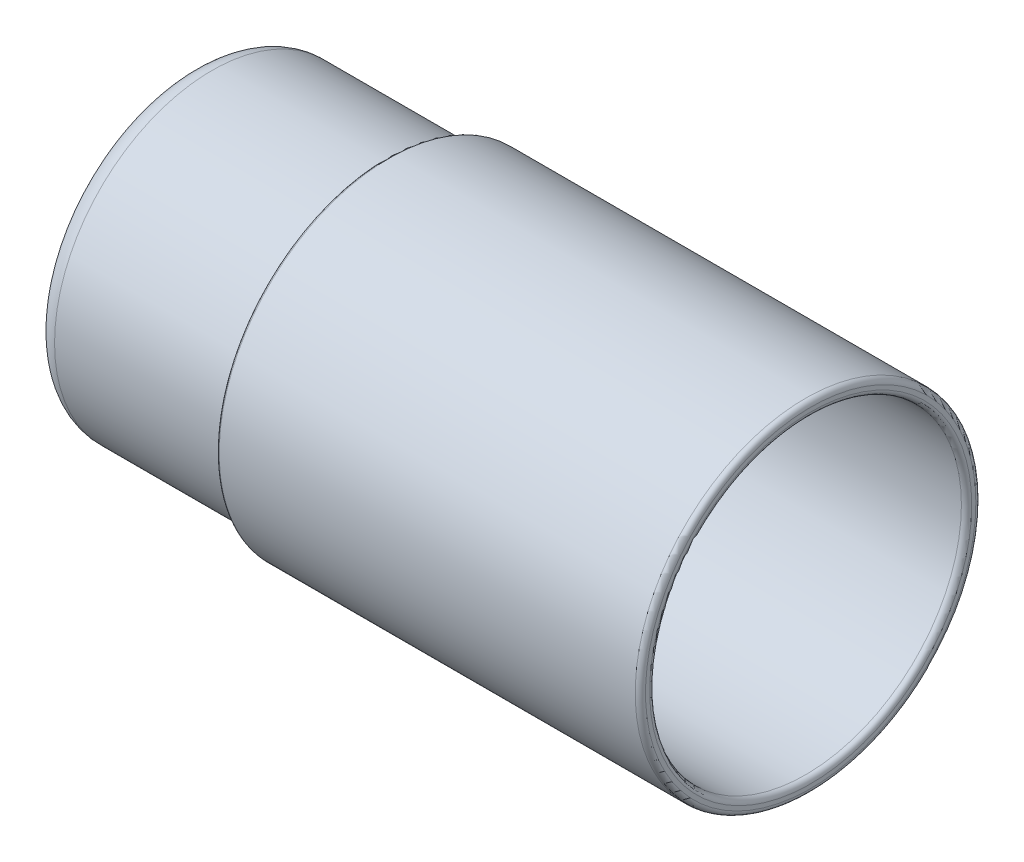
ISO-10303-21;
HEADER;
FILE_DESCRIPTION(('STEP AP214'),'2;1');
FILE_NAME('part.step','',(''),(''),'','','');
FILE_SCHEMA(('AUTOMOTIVE_DESIGN { 1 0 10303 214 1 1 1 1 }'));
ENDSEC;
DATA;
#1=APPLICATION_CONTEXT('core data for automotive mechanical design processes');
#2=APPLICATION_PROTOCOL_DEFINITION('international standard','automotive_design',2000,#1);
#3=PRODUCT_CONTEXT('',#1,'mechanical');
#4=PRODUCT('Part','Part','',(#3));
#5=PRODUCT_RELATED_PRODUCT_CATEGORY('part','',(#4));
#6=PRODUCT_DEFINITION_FORMATION('','',#4);
#7=PRODUCT_DEFINITION_CONTEXT('part definition',#1,'design');
#8=PRODUCT_DEFINITION('design','',#6,#7);
#9=PRODUCT_DEFINITION_SHAPE('','',#8);
#10=(LENGTH_UNIT() NAMED_UNIT(*) SI_UNIT(.MILLI.,.METRE.));
#11=(NAMED_UNIT(*) PLANE_ANGLE_UNIT() SI_UNIT($,.RADIAN.));
#12=(NAMED_UNIT(*) SI_UNIT($,.STERADIAN.) SOLID_ANGLE_UNIT());
#13=UNCERTAINTY_MEASURE_WITH_UNIT(LENGTH_MEASURE(1.E-05),#10,'distance_accuracy_value','');
#14=(GEOMETRIC_REPRESENTATION_CONTEXT(3) GLOBAL_UNCERTAINTY_ASSIGNED_CONTEXT((#13)) GLOBAL_UNIT_ASSIGNED_CONTEXT((#10,
#11,#12)) REPRESENTATION_CONTEXT('',''));
#15=CARTESIAN_POINT('',(0.,0.,0.));
#16=DIRECTION('',(0.,0.,1.));
#17=DIRECTION('',(1.,0.,0.));
#18=AXIS2_PLACEMENT_3D('',#15,#16,#17);
#19=CARTESIAN_POINT('',(0.,0.,0.));
#20=DIRECTION('',(-1.,0.,0.));
#21=DIRECTION('',(0.,0.,1.));
#22=AXIS2_PLACEMENT_3D('',#19,#20,#21);
#23=PLANE('',#22);
#24=CARTESIAN_POINT('',(0.,0.,0.));
#25=DIRECTION('',(1.,0.,0.));
#26=DIRECTION('',(0.,0.,-1.));
#27=AXIS2_PLACEMENT_3D('',#24,#25,#26);
#28=CIRCLE('',#27,13.25);
#29=CARTESIAN_POINT('',(0.,0.,-13.25));
#30=VERTEX_POINT('',#29);
#31=EDGE_CURVE('E10',#30,#30,#28,.T.);
#32=ORIENTED_EDGE('',*,*,#31,.F.);
#33=EDGE_LOOP('',(#32));
#34=FACE_BOUND('',#33,.T.);
#35=ADVANCED_FACE('F43',(#34),#23,.T.);
#36=CARTESIAN_POINT('',(2.,0.,0.));
#37=DIRECTION('',(1.,0.,0.));
#38=DIRECTION('',(0.,0.,-1.));
#39=AXIS2_PLACEMENT_3D('',#36,#37,#38);
#40=TOROIDAL_SURFACE('',#39,13.25,2.);
#41=ORIENTED_EDGE('',*,*,#31,.T.);
#42=EDGE_LOOP('',(#41));
#43=FACE_BOUND('',#42,.T.);
#44=CARTESIAN_POINT('',(2.,0.,0.));
#45=DIRECTION('',(1.,0.,0.));
#46=DIRECTION('',(0.,0.,-1.));
#47=AXIS2_PLACEMENT_3D('',#44,#45,#46);
#48=CIRCLE('',#47,15.25);
#49=CARTESIAN_POINT('',(2.,0.,-15.25));
#50=VERTEX_POINT('',#49);
#51=EDGE_CURVE('E50',#50,#50,#48,.T.);
#52=ORIENTED_EDGE('',*,*,#51,.F.);
#53=EDGE_LOOP('',(#52));
#54=FACE_BOUND('',#53,.T.);
#55=ADVANCED_FACE('F111',(#43,#54),#40,.T.);
#56=CARTESIAN_POINT('',(30.,0.,0.));
#57=DIRECTION('',(1.,0.,0.));
#58=DIRECTION('',(0.,0.,-1.));
#59=AXIS2_PLACEMENT_3D('',#56,#57,#58);
#60=CYLINDRICAL_SURFACE('',#59,15.25);
#61=ORIENTED_EDGE('',*,*,#51,.T.);
#62=EDGE_LOOP('',(#61));
#63=FACE_BOUND('',#62,.T.);
#64=CARTESIAN_POINT('',(19.,0.,0.));
#65=DIRECTION('',(1.,0.,0.));
#66=DIRECTION('',(0.,0.,-1.));
#67=AXIS2_PLACEMENT_3D('',#64,#65,#66);
#68=CIRCLE('',#67,15.25);
#69=CARTESIAN_POINT('',(19.,0.,-15.25));
#70=VERTEX_POINT('',#69);
#71=EDGE_CURVE('E55',#70,#70,#68,.T.);
#72=ORIENTED_EDGE('',*,*,#71,.F.);
#73=EDGE_LOOP('',(#72));
#74=FACE_BOUND('',#73,.T.);
#75=ADVANCED_FACE('F116',(#63,#74),#60,.T.);
#76=CARTESIAN_POINT('',(19.,0.,-15.25));
#77=DIRECTION('',(-1.,0.,0.));
#78=DIRECTION('',(0.,0.,1.));
#79=AXIS2_PLACEMENT_3D('',#76,#77,#78);
#80=PLANE('',#79);
#81=ORIENTED_EDGE('',*,*,#71,.T.);
#82=EDGE_LOOP('',(#81));
#83=FACE_BOUND('',#82,.T.);
#84=CARTESIAN_POINT('',(19.,0.,0.));
#85=DIRECTION('',(1.,0.,0.));
#86=DIRECTION('',(0.,0.,-1.));
#87=AXIS2_PLACEMENT_3D('',#84,#85,#86);
#88=CIRCLE('',#87,16.3);
#89=CARTESIAN_POINT('',(19.,0.,-16.3));
#90=VERTEX_POINT('',#89);
#91=EDGE_CURVE('E60',#90,#90,#88,.T.);
#92=ORIENTED_EDGE('',*,*,#91,.F.);
#93=EDGE_LOOP('',(#92));
#94=FACE_BOUND('',#93,.T.);
#95=ADVANCED_FACE('F120',(#83,#94),#80,.T.);
#96=CARTESIAN_POINT('',(19.2,0.,0.));
#97=DIRECTION('',(1.,0.,0.));
#98=DIRECTION('',(0.,0.,-1.));
#99=AXIS2_PLACEMENT_3D('',#96,#97,#98);
#100=TOROIDAL_SURFACE('',#99,16.3,0.199999999999997);
#101=ORIENTED_EDGE('',*,*,#91,.T.);
#102=EDGE_LOOP('',(#101));
#103=FACE_BOUND('',#102,.T.);
#104=CARTESIAN_POINT('',(19.2,0.,0.));
#105=DIRECTION('',(1.,0.,0.));
#106=DIRECTION('',(0.,0.,-1.));
#107=AXIS2_PLACEMENT_3D('',#104,#105,#106);
#108=CIRCLE('',#107,16.5);
#109=CARTESIAN_POINT('',(19.2,0.,-16.5));
#110=VERTEX_POINT('',#109);
#111=EDGE_CURVE('E66',#110,#110,#108,.T.);
#112=ORIENTED_EDGE('',*,*,#111,.F.);
#113=EDGE_LOOP('',(#112));
#114=FACE_BOUND('',#113,.T.);
#115=ADVANCED_FACE('F126',(#103,#114),#100,.T.);
#116=CARTESIAN_POINT('',(30.,0.,0.));
#117=DIRECTION('',(1.,0.,0.));
#118=DIRECTION('',(0.,0.,-1.));
#119=AXIS2_PLACEMENT_3D('',#116,#117,#118);
#120=CYLINDRICAL_SURFACE('',#119,16.5);
#121=ORIENTED_EDGE('',*,*,#111,.T.);
#122=EDGE_LOOP('',(#121));
#123=FACE_BOUND('',#122,.T.);
#124=CARTESIAN_POINT('',(59.5,0.,0.));
#125=DIRECTION('',(1.,0.,0.));
#126=DIRECTION('',(0.,0.,-1.));
#127=AXIS2_PLACEMENT_3D('',#124,#125,#126);
#128=CIRCLE('',#127,16.5);
#129=CARTESIAN_POINT('',(59.5,0.,-16.5));
#130=VERTEX_POINT('',#129);
#131=EDGE_CURVE('E70',#130,#130,#128,.T.);
#132=ORIENTED_EDGE('',*,*,#131,.F.);
#133=EDGE_LOOP('',(#132));
#134=FACE_BOUND('',#133,.T.);
#135=ADVANCED_FACE('F130',(#123,#134),#120,.T.);
#136=CARTESIAN_POINT('',(59.5,0.,0.));
#137=DIRECTION('',(1.,0.,0.));
#138=DIRECTION('',(0.,0.,-1.));
#139=AXIS2_PLACEMENT_3D('',#136,#137,#138);
#140=TOROIDAL_SURFACE('',#139,16.,0.499999999999997);
#141=ORIENTED_EDGE('',*,*,#131,.T.);
#142=EDGE_LOOP('',(#141));
#143=FACE_BOUND('',#142,.T.);
#144=CARTESIAN_POINT('',(60.,0.,0.));
#145=DIRECTION('',(1.,0.,0.));
#146=DIRECTION('',(0.,0.,-1.));
#147=AXIS2_PLACEMENT_3D('',#144,#145,#146);
#148=CIRCLE('',#147,16.);
#149=CARTESIAN_POINT('',(60.,0.,-16.));
#150=VERTEX_POINT('',#149);
#151=EDGE_CURVE('E74',#150,#150,#148,.T.);
#152=ORIENTED_EDGE('',*,*,#151,.F.);
#153=EDGE_LOOP('',(#152));
#154=FACE_BOUND('',#153,.T.);
#155=ADVANCED_FACE('F134',(#143,#154),#140,.T.);
#156=CARTESIAN_POINT('',(60.,0.,-16.));
#157=DIRECTION('',(1.,0.,0.));
#158=DIRECTION('',(0.,0.,-1.));
#159=AXIS2_PLACEMENT_3D('',#156,#157,#158);
#160=PLANE('',#159);
#161=ORIENTED_EDGE('',*,*,#151,.T.);
#162=EDGE_LOOP('',(#161));
#163=FACE_BOUND('',#162,.T.);
#164=CARTESIAN_POINT('',(60.,0.,0.));
#165=DIRECTION('',(1.,0.,0.));
#166=DIRECTION('',(0.,0.,-1.));
#167=AXIS2_PLACEMENT_3D('',#164,#165,#166);
#168=CIRCLE('',#167,15.6);
#169=CARTESIAN_POINT('',(60.,0.,-15.6));
#170=VERTEX_POINT('',#169);
#171=EDGE_CURVE('E78',#170,#170,#168,.T.);
#172=ORIENTED_EDGE('',*,*,#171,.F.);
#173=EDGE_LOOP('',(#172));
#174=FACE_BOUND('',#173,.T.);
#175=ADVANCED_FACE('F138',(#163,#174),#160,.T.);
#176=CARTESIAN_POINT('',(59.5,0.,0.));
#177=DIRECTION('',(1.,0.,0.));
#178=DIRECTION('',(0.,0.,-1.));
#179=AXIS2_PLACEMENT_3D('',#176,#177,#178);
#180=TOROIDAL_SURFACE('',#179,15.6,0.500000000000004);
#181=ORIENTED_EDGE('',*,*,#171,.T.);
#182=EDGE_LOOP('',(#181));
#183=FACE_BOUND('',#182,.T.);
#184=CARTESIAN_POINT('',(59.5,0.,0.));
#185=DIRECTION('',(1.,0.,0.));
#186=DIRECTION('',(0.,0.,-1.));
#187=AXIS2_PLACEMENT_3D('',#184,#185,#186);
#188=CIRCLE('',#187,15.1);
#189=CARTESIAN_POINT('',(59.5,0.,-15.1));
#190=VERTEX_POINT('',#189);
#191=EDGE_CURVE('E82',#190,#190,#188,.T.);
#192=ORIENTED_EDGE('',*,*,#191,.F.);
#193=EDGE_LOOP('',(#192));
#194=FACE_BOUND('',#193,.T.);
#195=ADVANCED_FACE('F107',(#183,#194),#180,.T.);
#196=CARTESIAN_POINT('',(30.,0.,0.));
#197=DIRECTION('',(1.,0.,0.));
#198=DIRECTION('',(0.,0.,-1.));
#199=AXIS2_PLACEMENT_3D('',#196,#197,#198);
#200=CYLINDRICAL_SURFACE('',#199,15.1);
#201=ORIENTED_EDGE('',*,*,#191,.T.);
#202=EDGE_LOOP('',(#201));
#203=FACE_BOUND('',#202,.T.);
#204=CARTESIAN_POINT('',(32.,0.,0.));
#205=DIRECTION('',(1.,0.,0.));
#206=DIRECTION('',(0.,0.,-1.));
#207=AXIS2_PLACEMENT_3D('',#204,#205,#206);
#208=CIRCLE('',#207,15.1);
#209=CARTESIAN_POINT('',(32.,0.,-15.1));
#210=VERTEX_POINT('',#209);
#211=EDGE_CURVE('E86',#210,#210,#208,.T.);
#212=ORIENTED_EDGE('',*,*,#211,.F.);
#213=EDGE_LOOP('',(#212));
#214=FACE_BOUND('',#213,.T.);
#215=ADVANCED_FACE('F99',(#203,#214),#200,.F.);
#216=CARTESIAN_POINT('',(32.,0.,0.));
#217=DIRECTION('',(1.,0.,0.));
#218=DIRECTION('',(0.,0.,-1.));
#219=AXIS2_PLACEMENT_3D('',#216,#217,#218);
#220=TOROIDAL_SURFACE('',#219,13.1,2.);
#221=ORIENTED_EDGE('',*,*,#211,.T.);
#222=EDGE_LOOP('',(#221));
#223=FACE_BOUND('',#222,.T.);
#224=CARTESIAN_POINT('',(30.,0.,0.));
#225=DIRECTION('',(1.,0.,0.));
#226=DIRECTION('',(0.,0.,-1.));
#227=AXIS2_PLACEMENT_3D('',#224,#225,#226);
#228=CIRCLE('',#227,13.1);
#229=CARTESIAN_POINT('',(30.,0.,-13.1));
#230=VERTEX_POINT('',#229);
#231=EDGE_CURVE('E90',#230,#230,#228,.T.);
#232=ORIENTED_EDGE('',*,*,#231,.F.);
#233=EDGE_LOOP('',(#232));
#234=FACE_BOUND('',#233,.T.);
#235=ADVANCED_FACE('F97',(#223,#234),#220,.F.);
#236=CARTESIAN_POINT('',(30.,0.,-13.1));
#237=DIRECTION('',(1.,0.,0.));
#238=DIRECTION('',(0.,0.,-1.));
#239=AXIS2_PLACEMENT_3D('',#236,#237,#238);
#240=PLANE('',#239);
#241=ORIENTED_EDGE('',*,*,#231,.T.);
#242=EDGE_LOOP('',(#241));
#243=FACE_BOUND('',#242,.T.);
#244=ADVANCED_FACE('F95',(#243),#240,.T.);
#245=CLOSED_SHELL('',(#35,#55,#75,#95,#115,#135,#155,#175,#195,#215,#235,#244));
#246=MANIFOLD_SOLID_BREP('B2',#245);
#247=ADVANCED_BREP_SHAPE_REPRESENTATION('',(#18,#246),#14);
#248=SHAPE_DEFINITION_REPRESENTATION(#9,#247);
ENDSEC;
END-ISO-10303-21;
